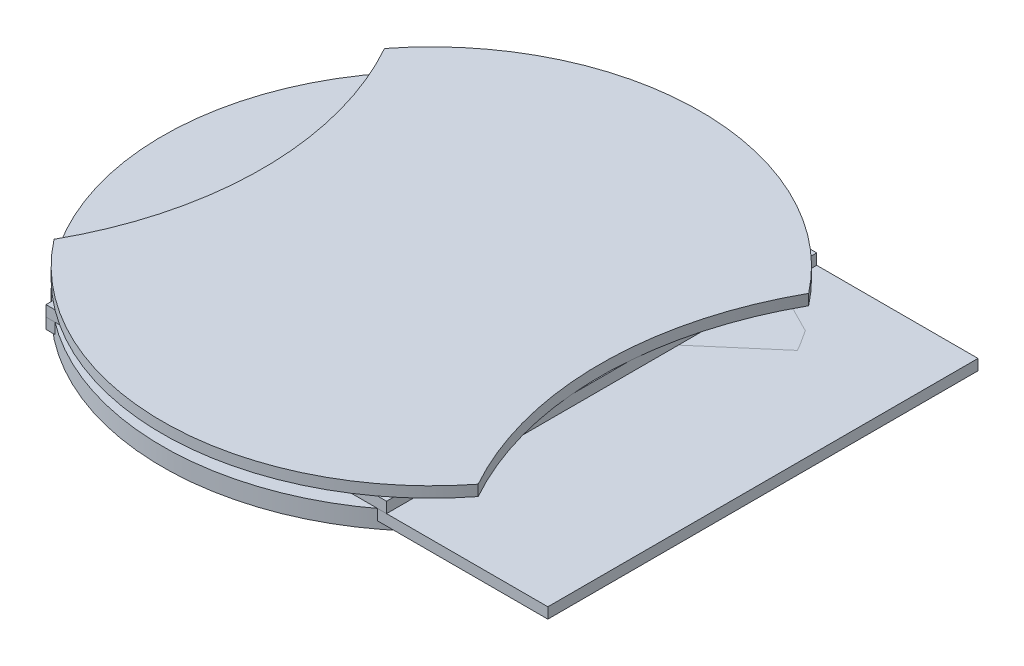
ISO-10303-21;
HEADER;
FILE_DESCRIPTION(('STEP AP214'),'2;1');
FILE_NAME('part.step','',(''),(''),'','','');
FILE_SCHEMA(('AUTOMOTIVE_DESIGN { 1 0 10303 214 1 1 1 1 }'));
ENDSEC;
DATA;
#1=APPLICATION_CONTEXT('core data for automotive mechanical design processes');
#2=APPLICATION_PROTOCOL_DEFINITION('international standard','automotive_design',2000,#1);
#3=PRODUCT_CONTEXT('',#1,'mechanical');
#4=PRODUCT('Part','Part','',(#3));
#5=PRODUCT_RELATED_PRODUCT_CATEGORY('part','',(#4));
#6=PRODUCT_DEFINITION_FORMATION('','',#4);
#7=PRODUCT_DEFINITION_CONTEXT('part definition',#1,'design');
#8=PRODUCT_DEFINITION('design','',#6,#7);
#9=PRODUCT_DEFINITION_SHAPE('','',#8);
#10=(LENGTH_UNIT() NAMED_UNIT(*) SI_UNIT(.MILLI.,.METRE.));
#11=(NAMED_UNIT(*) PLANE_ANGLE_UNIT() SI_UNIT($,.RADIAN.));
#12=(NAMED_UNIT(*) SI_UNIT($,.STERADIAN.) SOLID_ANGLE_UNIT());
#13=UNCERTAINTY_MEASURE_WITH_UNIT(LENGTH_MEASURE(1.E-05),#10,'distance_accuracy_value','');
#14=(GEOMETRIC_REPRESENTATION_CONTEXT(3) GLOBAL_UNCERTAINTY_ASSIGNED_CONTEXT((#13)) GLOBAL_UNIT_ASSIGNED_CONTEXT((#10,
#11,#12)) REPRESENTATION_CONTEXT('',''));
#15=CARTESIAN_POINT('',(0.,0.,0.));
#16=DIRECTION('',(0.,0.,1.));
#17=DIRECTION('',(1.,0.,0.));
#18=AXIS2_PLACEMENT_3D('',#15,#16,#17);
#19=CARTESIAN_POINT('',(7.49999999999986,13.,-5.15));
#20=DIRECTION('',(0.,-1.,0.));
#21=DIRECTION('',(0.,0.,-1.));
#22=AXIS2_PLACEMENT_3D('',#19,#20,#21);
#23=CYLINDRICAL_SURFACE('',#22,1.25);
#24=CARTESIAN_POINT('',(7.49999999999986,3.,-5.15));
#25=DIRECTION('',(0.,-1.,0.));
#26=DIRECTION('',(0.,0.,-1.));
#27=AXIS2_PLACEMENT_3D('',#24,#25,#26);
#28=CIRCLE('',#27,1.25);
#29=CARTESIAN_POINT('',(7.49999999999986,3.,-6.4));
#30=VERTEX_POINT('',#29);
#31=EDGE_CURVE('E97',#30,#30,#28,.F.);
#32=ORIENTED_EDGE('',*,*,#31,.T.);
#33=EDGE_LOOP('',(#32));
#34=FACE_BOUND('',#33,.T.);
#35=CARTESIAN_POINT('',(7.49999999999986,-2.,-5.15));
#36=DIRECTION('',(0.,-1.,0.));
#37=DIRECTION('',(0.,0.,-1.));
#38=AXIS2_PLACEMENT_3D('',#35,#36,#37);
#39=CIRCLE('',#38,1.25);
#40=CARTESIAN_POINT('',(7.49999999999986,-2.,-6.4));
#41=VERTEX_POINT('',#40);
#42=EDGE_CURVE('E109',#41,#41,#39,.T.);
#43=ORIENTED_EDGE('',*,*,#42,.T.);
#44=EDGE_LOOP('',(#43));
#45=FACE_BOUND('',#44,.T.);
#46=ADVANCED_FACE('F52',(#34,#45),#23,.F.);
#47=CARTESIAN_POINT('',(87.4999999999999,13.,-5.14999999999999));
#48=DIRECTION('',(0.,-1.,0.));
#49=DIRECTION('',(0.,0.,-1.));
#50=AXIS2_PLACEMENT_3D('',#47,#48,#49);
#51=CYLINDRICAL_SURFACE('',#50,1.25000000000001);
#52=CARTESIAN_POINT('',(87.4999999999999,3.,-5.14999999999999));
#53=DIRECTION('',(0.,-1.,0.));
#54=DIRECTION('',(0.,0.,-1.));
#55=AXIS2_PLACEMENT_3D('',#52,#53,#54);
#56=CIRCLE('',#55,1.25000000000001);
#57=CARTESIAN_POINT('',(87.4999999999999,3.,-6.4));
#58=VERTEX_POINT('',#57);
#59=EDGE_CURVE('E93',#58,#58,#56,.F.);
#60=ORIENTED_EDGE('',*,*,#59,.T.);
#61=EDGE_LOOP('',(#60));
#62=FACE_BOUND('',#61,.T.);
#63=CARTESIAN_POINT('',(87.4999999999999,-2.,-5.14999999999999));
#64=DIRECTION('',(0.,-1.,0.));
#65=DIRECTION('',(0.,0.,-1.));
#66=AXIS2_PLACEMENT_3D('',#63,#64,#65);
#67=CIRCLE('',#66,1.25000000000001);
#68=CARTESIAN_POINT('',(87.4999999999999,-2.,-6.4));
#69=VERTEX_POINT('',#68);
#70=EDGE_CURVE('E66',#69,#69,#67,.T.);
#71=ORIENTED_EDGE('',*,*,#70,.T.);
#72=EDGE_LOOP('',(#71));
#73=FACE_BOUND('',#72,.T.);
#74=ADVANCED_FACE('F116',(#62,#73),#51,.F.);
#75=CARTESIAN_POINT('',(87.4999999999999,13.,-114.85));
#76=DIRECTION('',(0.,-1.,0.));
#77=DIRECTION('',(0.,0.,-1.));
#78=AXIS2_PLACEMENT_3D('',#75,#76,#77);
#79=CYLINDRICAL_SURFACE('',#78,1.25000000000001);
#80=CARTESIAN_POINT('',(87.4999999999999,3.,-114.85));
#81=DIRECTION('',(0.,-1.,0.));
#82=DIRECTION('',(0.,0.,-1.));
#83=AXIS2_PLACEMENT_3D('',#80,#81,#82);
#84=CIRCLE('',#83,1.25000000000001);
#85=CARTESIAN_POINT('',(87.4999999999999,3.,-116.1));
#86=VERTEX_POINT('',#85);
#87=EDGE_CURVE('E79',#86,#86,#84,.F.);
#88=ORIENTED_EDGE('',*,*,#87,.T.);
#89=EDGE_LOOP('',(#88));
#90=FACE_BOUND('',#89,.T.);
#91=CARTESIAN_POINT('',(87.4999999999999,-2.,-114.85));
#92=DIRECTION('',(0.,-1.,0.));
#93=DIRECTION('',(0.,0.,-1.));
#94=AXIS2_PLACEMENT_3D('',#91,#92,#93);
#95=CIRCLE('',#94,1.25000000000001);
#96=CARTESIAN_POINT('',(87.4999999999999,-2.,-116.1));
#97=VERTEX_POINT('',#96);
#98=EDGE_CURVE('E101',#97,#97,#95,.T.);
#99=ORIENTED_EDGE('',*,*,#98,.T.);
#100=EDGE_LOOP('',(#99));
#101=FACE_BOUND('',#100,.T.);
#102=ADVANCED_FACE('F131',(#90,#101),#79,.F.);
#103=CARTESIAN_POINT('',(7.49999999999986,13.,-114.85));
#104=DIRECTION('',(0.,-1.,0.));
#105=DIRECTION('',(0.,0.,-1.));
#106=AXIS2_PLACEMENT_3D('',#103,#104,#105);
#107=CYLINDRICAL_SURFACE('',#106,1.25);
#108=CARTESIAN_POINT('',(7.49999999999986,3.,-114.85));
#109=DIRECTION('',(0.,-1.,0.));
#110=DIRECTION('',(0.,0.,-1.));
#111=AXIS2_PLACEMENT_3D('',#108,#109,#110);
#112=CIRCLE('',#111,1.25);
#113=CARTESIAN_POINT('',(7.49999999999986,3.,-116.1));
#114=VERTEX_POINT('',#113);
#115=EDGE_CURVE('E72',#114,#114,#112,.F.);
#116=ORIENTED_EDGE('',*,*,#115,.T.);
#117=EDGE_LOOP('',(#116));
#118=FACE_BOUND('',#117,.T.);
#119=CARTESIAN_POINT('',(7.49999999999986,-2.,-114.85));
#120=DIRECTION('',(0.,-1.,0.));
#121=DIRECTION('',(0.,0.,-1.));
#122=AXIS2_PLACEMENT_3D('',#119,#120,#121);
#123=CIRCLE('',#122,1.25);
#124=CARTESIAN_POINT('',(7.49999999999986,-2.,-116.1));
#125=VERTEX_POINT('',#124);
#126=EDGE_CURVE('E105',#125,#125,#123,.T.);
#127=ORIENTED_EDGE('',*,*,#126,.T.);
#128=EDGE_LOOP('',(#127));
#129=FACE_BOUND('',#128,.T.);
#130=ADVANCED_FACE('F133',(#118,#129),#107,.F.);
#131=CARTESIAN_POINT('',(47.5,3.,-60.));
#132=DIRECTION('',(0.,-1.,0.));
#133=DIRECTION('',(0.,0.,-1.));
#134=AXIS2_PLACEMENT_3D('',#131,#132,#133);
#135=PLANE('',#134);
#136=CARTESIAN_POINT('',(107.5,3.,-60.));
#137=DIRECTION('',(0.,1.,0.));
#138=DIRECTION('',(0.,0.,1.));
#139=AXIS2_PLACEMENT_3D('',#136,#137,#138);
#140=CIRCLE('',#139,8.50000000000001);
#141=CARTESIAN_POINT('',(107.5,3.,-51.5));
#142=VERTEX_POINT('',#141);
#143=EDGE_CURVE('E87',#142,#142,#140,.T.);
#144=ORIENTED_EDGE('',*,*,#143,.F.);
#145=EDGE_LOOP('',(#144));
#146=FACE_BOUND('',#145,.T.);
#147=CARTESIAN_POINT('',(47.5,3.,-60.));
#148=DIRECTION('',(0.,1.,0.));
#149=DIRECTION('',(0.,0.,1.));
#150=AXIS2_PLACEMENT_3D('',#147,#148,#149);
#151=CIRCLE('',#150,8.5);
#152=CARTESIAN_POINT('',(47.5,3.,-51.5));
#153=VERTEX_POINT('',#152);
#154=EDGE_CURVE('E73',#153,#153,#151,.T.);
#155=ORIENTED_EDGE('',*,*,#154,.F.);
#156=EDGE_LOOP('',(#155));
#157=FACE_BOUND('',#156,.T.);
#158=CARTESIAN_POINT('',(47.5,3.,-60.));
#159=DIRECTION('',(0.,-1.,0.));
#160=DIRECTION('',(0.,0.,-1.));
#161=AXIS2_PLACEMENT_3D('',#158,#159,#160);
#162=CIRCLE('',#161,75.);
#163=CARTESIAN_POINT('',(47.5,3.,-135.));
#164=VERTEX_POINT('',#163);
#165=EDGE_CURVE('E11',#164,#164,#162,.T.);
#166=ORIENTED_EDGE('',*,*,#165,.F.);
#167=EDGE_LOOP('',(#166));
#168=FACE_BOUND('',#167,.T.);
#169=ORIENTED_EDGE('',*,*,#59,.F.);
#170=EDGE_LOOP('',(#169));
#171=FACE_BOUND('',#170,.T.);
#172=ORIENTED_EDGE('',*,*,#115,.F.);
#173=EDGE_LOOP('',(#172));
#174=FACE_BOUND('',#173,.T.);
#175=ORIENTED_EDGE('',*,*,#87,.F.);
#176=EDGE_LOOP('',(#175));
#177=FACE_BOUND('',#176,.T.);
#178=ORIENTED_EDGE('',*,*,#31,.F.);
#179=EDGE_LOOP('',(#178));
#180=FACE_BOUND('',#179,.T.);
#181=ADVANCED_FACE('F122',(#146,#157,#168,#171,#174,#177,#180),#135,.F.);
#182=CARTESIAN_POINT('',(47.5,-2.,-60.));
#183=DIRECTION('',(0.,-1.,0.));
#184=DIRECTION('',(0.,0.,-1.));
#185=AXIS2_PLACEMENT_3D('',#182,#183,#184);
#186=PLANE('',#185);
#187=CARTESIAN_POINT('',(107.5,-2.,-60.));
#188=DIRECTION('',(0.,-1.,0.));
#189=DIRECTION('',(0.,0.,-1.));
#190=AXIS2_PLACEMENT_3D('',#187,#188,#189);
#191=CIRCLE('',#190,8.50000000000001);
#192=CARTESIAN_POINT('',(107.5,-2.,-68.5));
#193=VERTEX_POINT('',#192);
#194=EDGE_CURVE('E55',#193,#193,#191,.T.);
#195=ORIENTED_EDGE('',*,*,#194,.F.);
#196=EDGE_LOOP('',(#195));
#197=FACE_BOUND('',#196,.T.);
#198=CARTESIAN_POINT('',(47.5,-2.,-60.));
#199=DIRECTION('',(0.,-1.,0.));
#200=DIRECTION('',(0.,0.,-1.));
#201=AXIS2_PLACEMENT_3D('',#198,#199,#200);
#202=CIRCLE('',#201,8.5);
#203=CARTESIAN_POINT('',(47.5,-2.,-68.5));
#204=VERTEX_POINT('',#203);
#205=EDGE_CURVE('E69',#204,#204,#202,.T.);
#206=ORIENTED_EDGE('',*,*,#205,.F.);
#207=EDGE_LOOP('',(#206));
#208=FACE_BOUND('',#207,.T.);
#209=ORIENTED_EDGE('',*,*,#126,.F.);
#210=EDGE_LOOP('',(#209));
#211=FACE_BOUND('',#210,.T.);
#212=ORIENTED_EDGE('',*,*,#70,.F.);
#213=EDGE_LOOP('',(#212));
#214=FACE_BOUND('',#213,.T.);
#215=CARTESIAN_POINT('',(47.5,-2.,-60.));
#216=DIRECTION('',(0.,-1.,0.));
#217=DIRECTION('',(0.,0.,-1.));
#218=AXIS2_PLACEMENT_3D('',#215,#216,#217);
#219=CIRCLE('',#218,75.);
#220=CARTESIAN_POINT('',(47.5,-2.,-135.));
#221=VERTEX_POINT('',#220);
#222=EDGE_CURVE('E60',#221,#221,#219,.T.);
#223=ORIENTED_EDGE('',*,*,#222,.T.);
#224=EDGE_LOOP('',(#223));
#225=FACE_BOUND('',#224,.T.);
#226=ORIENTED_EDGE('',*,*,#42,.F.);
#227=EDGE_LOOP('',(#226));
#228=FACE_BOUND('',#227,.T.);
#229=ORIENTED_EDGE('',*,*,#98,.F.);
#230=EDGE_LOOP('',(#229));
#231=FACE_BOUND('',#230,.T.);
#232=ADVANCED_FACE('F118',(#197,#208,#211,#214,#225,#228,#231),#186,.T.);
#233=CARTESIAN_POINT('',(47.5,-2.,-60.));
#234=DIRECTION('',(0.,1.,0.));
#235=DIRECTION('',(0.,0.,1.));
#236=AXIS2_PLACEMENT_3D('',#233,#234,#235);
#237=CYLINDRICAL_SURFACE('',#236,75.);
#238=ORIENTED_EDGE('',*,*,#222,.F.);
#239=EDGE_LOOP('',(#238));
#240=FACE_BOUND('',#239,.T.);
#241=ORIENTED_EDGE('',*,*,#165,.T.);
#242=EDGE_LOOP('',(#241));
#243=FACE_BOUND('',#242,.T.);
#244=ADVANCED_FACE('F121',(#240,#243),#237,.T.);
#245=CARTESIAN_POINT('',(47.5,-7.,-60.));
#246=DIRECTION('',(0.,1.,0.));
#247=DIRECTION('',(0.,0.,1.));
#248=AXIS2_PLACEMENT_3D('',#245,#246,#247);
#249=CYLINDRICAL_SURFACE('',#248,8.5);
#250=ORIENTED_EDGE('',*,*,#205,.T.);
#251=EDGE_LOOP('',(#250));
#252=FACE_BOUND('',#251,.T.);
#253=ORIENTED_EDGE('',*,*,#154,.T.);
#254=EDGE_LOOP('',(#253));
#255=FACE_BOUND('',#254,.T.);
#256=ADVANCED_FACE('F160',(#252,#255),#249,.F.);
#257=CARTESIAN_POINT('',(107.5,-7.,-60.));
#258=DIRECTION('',(0.,1.,0.));
#259=DIRECTION('',(0.,0.,1.));
#260=AXIS2_PLACEMENT_3D('',#257,#258,#259);
#261=CYLINDRICAL_SURFACE('',#260,8.50000000000001);
#262=ORIENTED_EDGE('',*,*,#194,.T.);
#263=EDGE_LOOP('',(#262));
#264=FACE_BOUND('',#263,.T.);
#265=ORIENTED_EDGE('',*,*,#143,.T.);
#266=EDGE_LOOP('',(#265));
#267=FACE_BOUND('',#266,.T.);
#268=ADVANCED_FACE('F165',(#264,#267),#261,.F.);
#269=CLOSED_SHELL('',(#46,#74,#102,#130,#181,#232,#244,#256,#268));
#270=MANIFOLD_SOLID_BREP('B2',#269);
#271=CARTESIAN_POINT('',(47.5,9.,-60.));
#272=DIRECTION('',(0.,-1.,0.));
#273=DIRECTION('',(0.,0.,-1.));
#274=AXIS2_PLACEMENT_3D('',#271,#272,#273);
#275=CYLINDRICAL_SURFACE('',#274,75.);
#276=CARTESIAN_POINT('',(47.5,6.,-60.));
#277=DIRECTION('',(0.,1.,0.));
#278=DIRECTION('',(0.,0.,1.));
#279=AXIS2_PLACEMENT_3D('',#276,#277,#278);
#280=CIRCLE('',#279,75.);
#281=CARTESIAN_POINT('',(106.66,6.,-106.098746186854));
#282=VERTEX_POINT('',#281);
#283=CARTESIAN_POINT('',(-11.66,6.,-106.098746186854));
#284=VERTEX_POINT('',#283);
#285=EDGE_CURVE('E317',#282,#284,#280,.T.);
#286=ORIENTED_EDGE('',*,*,#285,.T.);
#287=DIRECTION('',(0.,1.,0.));
#288=VECTOR('',#287,1.);
#289=CARTESIAN_POINT('',(-11.66,0.,-106.098746186854));
#290=LINE('',#289,#288);
#291=CARTESIAN_POINT('',(-11.66,9.,-106.098746186854));
#292=VERTEX_POINT('',#291);
#293=EDGE_CURVE('E276',#284,#292,#290,.T.);
#294=ORIENTED_EDGE('',*,*,#293,.T.);
#295=CARTESIAN_POINT('',(47.5,9.,-60.));
#296=DIRECTION('',(0.,1.,0.));
#297=DIRECTION('',(0.,0.,1.));
#298=AXIS2_PLACEMENT_3D('',#295,#296,#297);
#299=CIRCLE('',#298,75.);
#300=CARTESIAN_POINT('',(106.66,9.,-106.098746186854));
#301=VERTEX_POINT('',#300);
#302=EDGE_CURVE('E315',#301,#292,#299,.T.);
#303=ORIENTED_EDGE('',*,*,#302,.F.);
#304=DIRECTION('',(0.,1.,0.));
#305=VECTOR('',#304,1.);
#306=CARTESIAN_POINT('',(106.66,0.,-106.098746186854));
#307=LINE('',#306,#305);
#308=EDGE_CURVE('E323',#282,#301,#307,.T.);
#309=ORIENTED_EDGE('',*,*,#308,.F.);
#310=EDGE_LOOP('',(#286,#294,#303,#309));
#311=FACE_BOUND('',#310,.T.);
#312=ADVANCED_FACE('F261',(#311),#275,.T.);
#313=CARTESIAN_POINT('',(-11.66,9.,-13.9012538131458));
#314=VERTEX_POINT('',#313);
#315=CARTESIAN_POINT('',(106.66,9.,-13.9012538131458));
#316=VERTEX_POINT('',#315);
#317=EDGE_CURVE('E313',#314,#316,#299,.T.);
#318=ORIENTED_EDGE('',*,*,#317,.F.);
#319=DIRECTION('',(0.,1.,0.));
#320=VECTOR('',#319,1.);
#321=CARTESIAN_POINT('',(-11.66,0.,-13.9012538131458));
#322=LINE('',#321,#320);
#323=CARTESIAN_POINT('',(-11.66,6.,-13.9012538131458));
#324=VERTEX_POINT('',#323);
#325=EDGE_CURVE('E299',#324,#314,#322,.T.);
#326=ORIENTED_EDGE('',*,*,#325,.F.);
#327=CARTESIAN_POINT('',(106.66,6.,-13.9012538131458));
#328=VERTEX_POINT('',#327);
#329=EDGE_CURVE('E320',#324,#328,#280,.T.);
#330=ORIENTED_EDGE('',*,*,#329,.T.);
#331=DIRECTION('',(0.,1.,0.));
#332=VECTOR('',#331,1.);
#333=CARTESIAN_POINT('',(106.66,0.,-13.9012538131458));
#334=LINE('',#333,#332);
#335=EDGE_CURVE('E283',#328,#316,#334,.T.);
#336=ORIENTED_EDGE('',*,*,#335,.T.);
#337=EDGE_LOOP('',(#318,#326,#330,#336));
#338=FACE_BOUND('',#337,.T.);
#339=ADVANCED_FACE('F263',(#338),#275,.T.);
#340=CARTESIAN_POINT('',(47.5,9.,-60.));
#341=DIRECTION('',(0.,1.,0.));
#342=DIRECTION('',(0.,0.,1.));
#343=AXIS2_PLACEMENT_3D('',#340,#341,#342);
#344=PLANE('',#343);
#345=CARTESIAN_POINT('',(-94.126810840622,9.,-60.));
#346=DIRECTION('',(0.,1.,0.));
#347=DIRECTION('',(0.,0.,-1.));
#348=AXIS2_PLACEMENT_3D('',#345,#346,#347);
#349=CIRCLE('',#348,94.4768187981736);
#350=EDGE_CURVE('E302',#314,#292,#349,.T.);
#351=ORIENTED_EDGE('',*,*,#350,.F.);
#352=ORIENTED_EDGE('',*,*,#317,.T.);
#353=CARTESIAN_POINT('',(189.126810840622,9.,-60.));
#354=DIRECTION('',(0.,1.,0.));
#355=DIRECTION('',(0.,0.,1.));
#356=AXIS2_PLACEMENT_3D('',#353,#354,#355);
#357=CIRCLE('',#356,94.4768187981736);
#358=EDGE_CURVE('E331',#301,#316,#357,.T.);
#359=ORIENTED_EDGE('',*,*,#358,.F.);
#360=ORIENTED_EDGE('',*,*,#302,.T.);
#361=EDGE_LOOP('',(#351,#352,#359,#360));
#362=FACE_BOUND('',#361,.T.);
#363=ADVANCED_FACE('F311',(#362),#344,.T.);
#364=CARTESIAN_POINT('',(47.5,6.,-60.));
#365=DIRECTION('',(0.,1.,0.));
#366=DIRECTION('',(0.,0.,1.));
#367=AXIS2_PLACEMENT_3D('',#364,#365,#366);
#368=PLANE('',#367);
#369=ORIENTED_EDGE('',*,*,#329,.F.);
#370=CARTESIAN_POINT('',(-94.126810840622,6.,-60.));
#371=DIRECTION('',(0.,1.,0.));
#372=DIRECTION('',(0.,0.,1.));
#373=AXIS2_PLACEMENT_3D('',#370,#371,#372);
#374=CIRCLE('',#373,94.4768187981736);
#375=EDGE_CURVE('E50',#324,#284,#374,.T.);
#376=ORIENTED_EDGE('',*,*,#375,.T.);
#377=ORIENTED_EDGE('',*,*,#285,.F.);
#378=CARTESIAN_POINT('',(189.126810840622,6.,-60.));
#379=DIRECTION('',(0.,1.,0.));
#380=DIRECTION('',(0.,0.,1.));
#381=AXIS2_PLACEMENT_3D('',#378,#379,#380);
#382=CIRCLE('',#381,94.4768187981736);
#383=EDGE_CURVE('E269',#282,#328,#382,.T.);
#384=ORIENTED_EDGE('',*,*,#383,.T.);
#385=EDGE_LOOP('',(#369,#376,#377,#384));
#386=FACE_BOUND('',#385,.T.);
#387=ADVANCED_FACE('F327',(#386),#368,.F.);
#388=CARTESIAN_POINT('',(189.126810840622,0.,-60.));
#389=DIRECTION('',(0.,1.,0.));
#390=DIRECTION('',(0.,0.,1.));
#391=AXIS2_PLACEMENT_3D('',#388,#389,#390);
#392=CYLINDRICAL_SURFACE('',#391,94.4768187981736);
#393=ORIENTED_EDGE('',*,*,#308,.T.);
#394=ORIENTED_EDGE('',*,*,#358,.T.);
#395=ORIENTED_EDGE('',*,*,#335,.F.);
#396=ORIENTED_EDGE('',*,*,#383,.F.);
#397=EDGE_LOOP('',(#393,#394,#395,#396));
#398=FACE_BOUND('',#397,.T.);
#399=ADVANCED_FACE('F329',(#398),#392,.F.);
#400=CARTESIAN_POINT('',(-94.126810840622,0.,-60.));
#401=DIRECTION('',(0.,1.,0.));
#402=DIRECTION('',(0.,0.,1.));
#403=AXIS2_PLACEMENT_3D('',#400,#401,#402);
#404=CYLINDRICAL_SURFACE('',#403,94.4768187981736);
#405=ORIENTED_EDGE('',*,*,#325,.T.);
#406=ORIENTED_EDGE('',*,*,#350,.T.);
#407=ORIENTED_EDGE('',*,*,#293,.F.);
#408=ORIENTED_EDGE('',*,*,#375,.F.);
#409=EDGE_LOOP('',(#405,#406,#407,#408));
#410=FACE_BOUND('',#409,.T.);
#411=ADVANCED_FACE('F301',(#410),#404,.F.);
#412=CLOSED_SHELL('',(#312,#339,#363,#387,#399,#411));
#413=MANIFOLD_SOLID_BREP('B6_NOT_SHOWN',#412);
#414=CARTESIAN_POINT('',(0.,6.,-120.));
#415=DIRECTION('',(1.,0.,0.));
#416=DIRECTION('',(0.,0.,-1.));
#417=AXIS2_PLACEMENT_3D('',#414,#415,#416);
#418=PLANE('',#417);
#419=DIRECTION('',(0.,0.,1.));
#420=VECTOR('',#419,1.);
#421=CARTESIAN_POINT('',(0.,3.,-120.));
#422=LINE('',#421,#420);
#423=CARTESIAN_POINT('',(0.,3.,-120.));
#424=VERTEX_POINT('',#423);
#425=CARTESIAN_POINT('',(0.,3.,0.));
#426=VERTEX_POINT('',#425);
#427=EDGE_CURVE('E454',#424,#426,#422,.T.);
#428=ORIENTED_EDGE('',*,*,#427,.T.);
#429=DIRECTION('',(0.,-1.,0.));
#430=VECTOR('',#429,1.);
#431=CARTESIAN_POINT('',(0.,6.,0.));
#432=LINE('',#431,#430);
#433=CARTESIAN_POINT('',(0.,6.,0.));
#434=VERTEX_POINT('',#433);
#435=EDGE_CURVE('E259',#434,#426,#432,.T.);
#436=ORIENTED_EDGE('',*,*,#435,.F.);
#437=DIRECTION('',(0.,0.,1.));
#438=VECTOR('',#437,1.);
#439=CARTESIAN_POINT('',(0.,6.,-120.));
#440=LINE('',#439,#438);
#441=CARTESIAN_POINT('',(0.,6.,-120.));
#442=VERTEX_POINT('',#441);
#443=EDGE_CURVE('E442',#442,#434,#440,.T.);
#444=ORIENTED_EDGE('',*,*,#443,.F.);
#445=DIRECTION('',(0.,-1.,0.));
#446=VECTOR('',#445,1.);
#447=CARTESIAN_POINT('',(0.,6.,-120.));
#448=LINE('',#447,#446);
#449=EDGE_CURVE('E450',#442,#424,#448,.T.);
#450=ORIENTED_EDGE('',*,*,#449,.T.);
#451=EDGE_LOOP('',(#428,#436,#444,#450));
#452=FACE_BOUND('',#451,.T.);
#453=ADVANCED_FACE('F391',(#452),#418,.F.);
#454=CARTESIAN_POINT('',(0.,6.,0.));
#455=DIRECTION('',(0.,0.,-1.));
#456=DIRECTION('',(-1.,0.,0.));
#457=AXIS2_PLACEMENT_3D('',#454,#455,#456);
#458=PLANE('',#457);
#459=DIRECTION('',(1.,0.,0.));
#460=VECTOR('',#459,1.);
#461=CARTESIAN_POINT('',(0.,3.,0.));
#462=LINE('',#461,#460);
#463=CARTESIAN_POINT('',(95.,3.,0.));
#464=VERTEX_POINT('',#463);
#465=EDGE_CURVE('E446',#426,#464,#462,.T.);
#466=ORIENTED_EDGE('',*,*,#465,.T.);
#467=DIRECTION('',(0.,-1.,0.));
#468=VECTOR('',#467,1.);
#469=CARTESIAN_POINT('',(95.,6.,0.));
#470=LINE('',#469,#468);
#471=CARTESIAN_POINT('',(95.,6.,0.));
#472=VERTEX_POINT('',#471);
#473=EDGE_CURVE('E399',#472,#464,#470,.T.);
#474=ORIENTED_EDGE('',*,*,#473,.F.);
#475=DIRECTION('',(1.,0.,0.));
#476=VECTOR('',#475,1.);
#477=CARTESIAN_POINT('',(0.,6.,0.));
#478=LINE('',#477,#476);
#479=EDGE_CURVE('E437',#434,#472,#478,.T.);
#480=ORIENTED_EDGE('',*,*,#479,.F.);
#481=ORIENTED_EDGE('',*,*,#435,.T.);
#482=EDGE_LOOP('',(#466,#474,#480,#481));
#483=FACE_BOUND('',#482,.T.);
#484=ADVANCED_FACE('F445',(#483),#458,.F.);
#485=CARTESIAN_POINT('',(95.,6.,-120.));
#486=DIRECTION('',(-1.,0.,0.));
#487=DIRECTION('',(0.,0.,1.));
#488=AXIS2_PLACEMENT_3D('',#485,#486,#487);
#489=PLANE('',#488);
#490=DIRECTION('',(0.,0.,-1.));
#491=VECTOR('',#490,1.);
#492=CARTESIAN_POINT('',(95.,3.,-120.));
#493=LINE('',#492,#491);
#494=CARTESIAN_POINT('',(95.,3.,-120.));
#495=VERTEX_POINT('',#494);
#496=EDGE_CURVE('E424',#464,#495,#493,.T.);
#497=ORIENTED_EDGE('',*,*,#496,.T.);
#498=DIRECTION('',(0.,-1.,0.));
#499=VECTOR('',#498,1.);
#500=CARTESIAN_POINT('',(95.,6.,-120.));
#501=LINE('',#500,#499);
#502=CARTESIAN_POINT('',(95.,6.,-120.));
#503=VERTEX_POINT('',#502);
#504=EDGE_CURVE('E447',#503,#495,#501,.T.);
#505=ORIENTED_EDGE('',*,*,#504,.F.);
#506=DIRECTION('',(0.,0.,-1.));
#507=VECTOR('',#506,1.);
#508=CARTESIAN_POINT('',(95.,6.,-120.));
#509=LINE('',#508,#507);
#510=EDGE_CURVE('E440',#472,#503,#509,.T.);
#511=ORIENTED_EDGE('',*,*,#510,.F.);
#512=ORIENTED_EDGE('',*,*,#473,.T.);
#513=EDGE_LOOP('',(#497,#505,#511,#512));
#514=FACE_BOUND('',#513,.T.);
#515=ADVANCED_FACE('F448',(#514),#489,.F.);
#516=CARTESIAN_POINT('',(0.,6.,-120.));
#517=DIRECTION('',(0.,0.,1.));
#518=DIRECTION('',(1.,0.,0.));
#519=AXIS2_PLACEMENT_3D('',#516,#517,#518);
#520=PLANE('',#519);
#521=DIRECTION('',(-1.,0.,0.));
#522=VECTOR('',#521,1.);
#523=CARTESIAN_POINT('',(0.,3.,-120.));
#524=LINE('',#523,#522);
#525=EDGE_CURVE('E430',#495,#424,#524,.T.);
#526=ORIENTED_EDGE('',*,*,#525,.T.);
#527=ORIENTED_EDGE('',*,*,#449,.F.);
#528=DIRECTION('',(-1.,0.,0.));
#529=VECTOR('',#528,1.);
#530=CARTESIAN_POINT('',(0.,6.,-120.));
#531=LINE('',#530,#529);
#532=EDGE_CURVE('E407',#503,#442,#531,.T.);
#533=ORIENTED_EDGE('',*,*,#532,.F.);
#534=ORIENTED_EDGE('',*,*,#504,.T.);
#535=EDGE_LOOP('',(#526,#527,#533,#534));
#536=FACE_BOUND('',#535,.T.);
#537=ADVANCED_FACE('F461',(#536),#520,.F.);
#538=CARTESIAN_POINT('',(0.,6.,0.));
#539=DIRECTION('',(0.,1.,0.));
#540=DIRECTION('',(0.,0.,1.));
#541=AXIS2_PLACEMENT_3D('',#538,#539,#540);
#542=PLANE('',#541);
#543=ORIENTED_EDGE('',*,*,#443,.T.);
#544=ORIENTED_EDGE('',*,*,#479,.T.);
#545=ORIENTED_EDGE('',*,*,#510,.T.);
#546=ORIENTED_EDGE('',*,*,#532,.T.);
#547=EDGE_LOOP('',(#543,#544,#545,#546));
#548=FACE_BOUND('',#547,.T.);
#549=ADVANCED_FACE('F438',(#548),#542,.T.);
#550=CARTESIAN_POINT('',(0.,3.,0.));
#551=DIRECTION('',(0.,1.,0.));
#552=DIRECTION('',(0.,0.,1.));
#553=AXIS2_PLACEMENT_3D('',#550,#551,#552);
#554=PLANE('',#553);
#555=ORIENTED_EDGE('',*,*,#427,.F.);
#556=ORIENTED_EDGE('',*,*,#525,.F.);
#557=ORIENTED_EDGE('',*,*,#496,.F.);
#558=ORIENTED_EDGE('',*,*,#465,.F.);
#559=EDGE_LOOP('',(#555,#556,#557,#558));
#560=FACE_BOUND('',#559,.T.);
#561=ADVANCED_FACE('F464',(#560),#554,.F.);
#562=CLOSED_SHELL('',(#453,#484,#515,#537,#549,#561));
#563=MANIFOLD_SOLID_BREP('B44_NOT_SHOWN',#562);
#564=CARTESIAN_POINT('',(0.,3.,0.));
#565=DIRECTION('',(1.,0.,0.));
#566=DIRECTION('',(0.,0.,-1.));
#567=AXIS2_PLACEMENT_3D('',#564,#565,#566);
#568=PLANE('',#567);
#569=DIRECTION('',(0.,0.,1.));
#570=VECTOR('',#569,1.);
#571=CARTESIAN_POINT('',(0.,0.,0.));
#572=LINE('',#571,#570);
#573=CARTESIAN_POINT('',(0.,0.,-120.));
#574=VERTEX_POINT('',#573);
#575=CARTESIAN_POINT('',(0.,0.,0.));
#576=VERTEX_POINT('',#575);
#577=EDGE_CURVE('E578',#574,#576,#572,.T.);
#578=ORIENTED_EDGE('',*,*,#577,.T.);
#579=DIRECTION('',(0.,-1.,0.));
#580=VECTOR('',#579,1.);
#581=CARTESIAN_POINT('',(0.,3.,0.));
#582=LINE('',#581,#580);
#583=CARTESIAN_POINT('',(0.,3.,0.));
#584=VERTEX_POINT('',#583);
#585=EDGE_CURVE('E389',#584,#576,#582,.T.);
#586=ORIENTED_EDGE('',*,*,#585,.F.);
#587=DIRECTION('',(0.,0.,1.));
#588=VECTOR('',#587,1.);
#589=CARTESIAN_POINT('',(0.,3.,0.));
#590=LINE('',#589,#588);
#591=CARTESIAN_POINT('',(0.,3.,-120.));
#592=VERTEX_POINT('',#591);
#593=EDGE_CURVE('E566',#592,#584,#590,.T.);
#594=ORIENTED_EDGE('',*,*,#593,.F.);
#595=DIRECTION('',(0.,-1.,0.));
#596=VECTOR('',#595,1.);
#597=CARTESIAN_POINT('',(0.,3.,-120.));
#598=LINE('',#597,#596);
#599=EDGE_CURVE('E574',#592,#574,#598,.T.);
#600=ORIENTED_EDGE('',*,*,#599,.T.);
#601=EDGE_LOOP('',(#578,#586,#594,#600));
#602=FACE_BOUND('',#601,.T.);
#603=ADVANCED_FACE('F515',(#602),#568,.F.);
#604=CARTESIAN_POINT('',(0.,3.,0.));
#605=DIRECTION('',(0.,0.,-1.));
#606=DIRECTION('',(-1.,0.,0.));
#607=AXIS2_PLACEMENT_3D('',#604,#605,#606);
#608=PLANE('',#607);
#609=DIRECTION('',(1.,0.,0.));
#610=VECTOR('',#609,1.);
#611=CARTESIAN_POINT('',(0.,0.,0.));
#612=LINE('',#611,#610);
#613=CARTESIAN_POINT('',(140.,0.,0.));
#614=VERTEX_POINT('',#613);
#615=EDGE_CURVE('E570',#576,#614,#612,.T.);
#616=ORIENTED_EDGE('',*,*,#615,.T.);
#617=DIRECTION('',(0.,-1.,0.));
#618=VECTOR('',#617,1.);
#619=CARTESIAN_POINT('',(140.,3.,0.));
#620=LINE('',#619,#618);
#621=CARTESIAN_POINT('',(140.,3.,0.));
#622=VERTEX_POINT('',#621);
#623=EDGE_CURVE('E523',#622,#614,#620,.T.);
#624=ORIENTED_EDGE('',*,*,#623,.F.);
#625=DIRECTION('',(1.,0.,0.));
#626=VECTOR('',#625,1.);
#627=CARTESIAN_POINT('',(0.,3.,0.));
#628=LINE('',#627,#626);
#629=EDGE_CURVE('E561',#584,#622,#628,.T.);
#630=ORIENTED_EDGE('',*,*,#629,.F.);
#631=ORIENTED_EDGE('',*,*,#585,.T.);
#632=EDGE_LOOP('',(#616,#624,#630,#631));
#633=FACE_BOUND('',#632,.T.);
#634=ADVANCED_FACE('F569',(#633),#608,.F.);
#635=CARTESIAN_POINT('',(140.,3.,0.));
#636=DIRECTION('',(-1.,0.,0.));
#637=DIRECTION('',(0.,0.,1.));
#638=AXIS2_PLACEMENT_3D('',#635,#636,#637);
#639=PLANE('',#638);
#640=DIRECTION('',(0.,0.,-1.));
#641=VECTOR('',#640,1.);
#642=CARTESIAN_POINT('',(140.,0.,0.));
#643=LINE('',#642,#641);
#644=CARTESIAN_POINT('',(140.,0.,-120.));
#645=VERTEX_POINT('',#644);
#646=EDGE_CURVE('E548',#614,#645,#643,.T.);
#647=ORIENTED_EDGE('',*,*,#646,.T.);
#648=DIRECTION('',(0.,-1.,0.));
#649=VECTOR('',#648,1.);
#650=CARTESIAN_POINT('',(140.,3.,-120.));
#651=LINE('',#650,#649);
#652=CARTESIAN_POINT('',(140.,3.,-120.));
#653=VERTEX_POINT('',#652);
#654=EDGE_CURVE('E571',#653,#645,#651,.T.);
#655=ORIENTED_EDGE('',*,*,#654,.F.);
#656=DIRECTION('',(0.,0.,-1.));
#657=VECTOR('',#656,1.);
#658=CARTESIAN_POINT('',(140.,3.,0.));
#659=LINE('',#658,#657);
#660=EDGE_CURVE('E564',#622,#653,#659,.T.);
#661=ORIENTED_EDGE('',*,*,#660,.F.);
#662=ORIENTED_EDGE('',*,*,#623,.T.);
#663=EDGE_LOOP('',(#647,#655,#661,#662));
#664=FACE_BOUND('',#663,.T.);
#665=ADVANCED_FACE('F572',(#664),#639,.F.);
#666=CARTESIAN_POINT('',(0.,3.,-120.));
#667=DIRECTION('',(0.,0.,1.));
#668=DIRECTION('',(1.,0.,0.));
#669=AXIS2_PLACEMENT_3D('',#666,#667,#668);
#670=PLANE('',#669);
#671=DIRECTION('',(-1.,0.,0.));
#672=VECTOR('',#671,1.);
#673=CARTESIAN_POINT('',(0.,0.,-120.));
#674=LINE('',#673,#672);
#675=EDGE_CURVE('E554',#645,#574,#674,.T.);
#676=ORIENTED_EDGE('',*,*,#675,.T.);
#677=ORIENTED_EDGE('',*,*,#599,.F.);
#678=DIRECTION('',(-1.,0.,0.));
#679=VECTOR('',#678,1.);
#680=CARTESIAN_POINT('',(0.,3.,-120.));
#681=LINE('',#680,#679);
#682=EDGE_CURVE('E531',#653,#592,#681,.T.);
#683=ORIENTED_EDGE('',*,*,#682,.F.);
#684=ORIENTED_EDGE('',*,*,#654,.T.);
#685=EDGE_LOOP('',(#676,#677,#683,#684));
#686=FACE_BOUND('',#685,.T.);
#687=ADVANCED_FACE('F585',(#686),#670,.F.);
#688=CARTESIAN_POINT('',(0.,3.,0.));
#689=DIRECTION('',(0.,-1.,0.));
#690=DIRECTION('',(0.,0.,-1.));
#691=AXIS2_PLACEMENT_3D('',#688,#689,#690);
#692=PLANE('',#691);
#693=ORIENTED_EDGE('',*,*,#593,.T.);
#694=ORIENTED_EDGE('',*,*,#629,.T.);
#695=ORIENTED_EDGE('',*,*,#660,.T.);
#696=ORIENTED_EDGE('',*,*,#682,.T.);
#697=EDGE_LOOP('',(#693,#694,#695,#696));
#698=FACE_BOUND('',#697,.T.);
#699=ADVANCED_FACE('F562',(#698),#692,.F.);
#700=CARTESIAN_POINT('',(0.,0.,0.));
#701=DIRECTION('',(0.,-1.,0.));
#702=DIRECTION('',(0.,0.,-1.));
#703=AXIS2_PLACEMENT_3D('',#700,#701,#702);
#704=PLANE('',#703);
#705=ORIENTED_EDGE('',*,*,#577,.F.);
#706=ORIENTED_EDGE('',*,*,#675,.F.);
#707=ORIENTED_EDGE('',*,*,#646,.F.);
#708=ORIENTED_EDGE('',*,*,#615,.F.);
#709=EDGE_LOOP('',(#705,#706,#707,#708));
#710=FACE_BOUND('',#709,.T.);
#711=ADVANCED_FACE('F588',(#710),#704,.T.);
#712=CLOSED_SHELL('',(#603,#634,#665,#687,#699,#711));
#713=MANIFOLD_SOLID_BREP('B253_NOT_SHOWN',#712);
#714=ADVANCED_BREP_SHAPE_REPRESENTATION('',(#18,#270,#413,#563,#713),#14);
#715=SHAPE_DEFINITION_REPRESENTATION(#9,#714);
ENDSEC;
END-ISO-10303-21;
